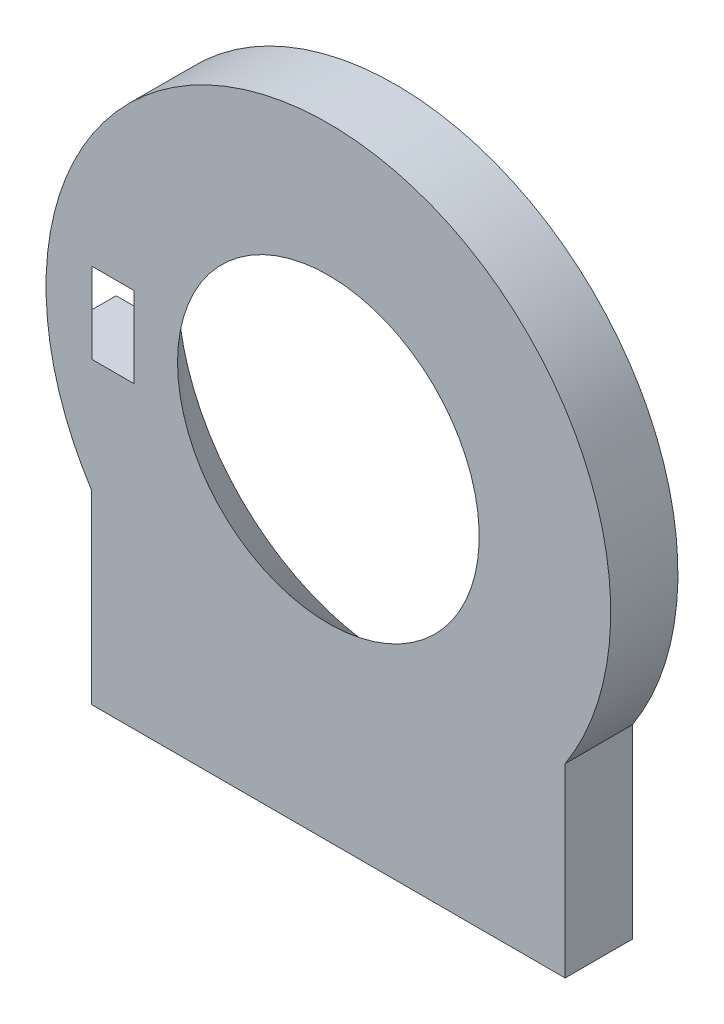
ISO-10303-21;
HEADER;
FILE_DESCRIPTION(('STEP AP214'),'2;1');
FILE_NAME('part.step','',(''),(''),'','','');
FILE_SCHEMA(('AUTOMOTIVE_DESIGN { 1 0 10303 214 1 1 1 1 }'));
ENDSEC;
DATA;
#1=APPLICATION_CONTEXT('core data for automotive mechanical design processes');
#2=APPLICATION_PROTOCOL_DEFINITION('international standard','automotive_design',2000,#1);
#3=PRODUCT_CONTEXT('',#1,'mechanical');
#4=PRODUCT('Part','Part','',(#3));
#5=PRODUCT_RELATED_PRODUCT_CATEGORY('part','',(#4));
#6=PRODUCT_DEFINITION_FORMATION('','',#4);
#7=PRODUCT_DEFINITION_CONTEXT('part definition',#1,'design');
#8=PRODUCT_DEFINITION('design','',#6,#7);
#9=PRODUCT_DEFINITION_SHAPE('','',#8);
#10=(LENGTH_UNIT() NAMED_UNIT(*) SI_UNIT(.MILLI.,.METRE.));
#11=(NAMED_UNIT(*) PLANE_ANGLE_UNIT() SI_UNIT($,.RADIAN.));
#12=(NAMED_UNIT(*) SI_UNIT($,.STERADIAN.) SOLID_ANGLE_UNIT());
#13=UNCERTAINTY_MEASURE_WITH_UNIT(LENGTH_MEASURE(1.E-05),#10,'distance_accuracy_value','');
#14=(GEOMETRIC_REPRESENTATION_CONTEXT(3) GLOBAL_UNCERTAINTY_ASSIGNED_CONTEXT((#13)) GLOBAL_UNIT_ASSIGNED_CONTEXT((#10,
#11,#12)) REPRESENTATION_CONTEXT('',''));
#15=CARTESIAN_POINT('',(0.,0.,0.));
#16=DIRECTION('',(0.,0.,1.));
#17=DIRECTION('',(1.,0.,0.));
#18=AXIS2_PLACEMENT_3D('',#15,#16,#17);
#19=CARTESIAN_POINT('',(0.,0.,10.));
#20=DIRECTION('',(0.,0.,-1.));
#21=DIRECTION('',(-1.,0.,0.));
#22=AXIS2_PLACEMENT_3D('',#19,#20,#21);
#23=CYLINDRICAL_SURFACE('',#22,42.);
#24=CARTESIAN_POINT('',(0.,0.,0.));
#25=DIRECTION('',(0.,0.,-1.));
#26=DIRECTION('',(-1.,0.,0.));
#27=AXIS2_PLACEMENT_3D('',#24,#25,#26);
#28=CIRCLE('',#27,42.);
#29=CARTESIAN_POINT('',(-41.5692193816531,6.,0.));
#30=VERTEX_POINT('',#29);
#31=CARTESIAN_POINT('',(35.2209667319211,-22.8797618534133,0.));
#32=VERTEX_POINT('',#31);
#33=EDGE_CURVE('E180',#30,#32,#28,.T.);
#34=ORIENTED_EDGE('',*,*,#33,.F.);
#35=DIRECTION('',(0.,0.,-1.));
#36=VECTOR('',#35,1.);
#37=CARTESIAN_POINT('',(-41.5692193816531,6.,10.));
#38=LINE('',#37,#36);
#39=CARTESIAN_POINT('',(-41.5692193816531,6.,5.62131024748512));
#40=VERTEX_POINT('',#39);
#41=EDGE_CURVE('E151',#30,#40,#38,.F.);
#42=ORIENTED_EDGE('',*,*,#41,.T.);
#43=CARTESIAN_POINT('',(0.,0.,34.0397707653471));
#44=DIRECTION('',(0.564364144456013,0.,-0.825525961101426));
#45=DIRECTION('',(-0.825525961101426,0.,-0.564364144456013));
#46=AXIS2_PLACEMENT_3D('',#43,#44,#45);
#47=ELLIPSE('',#46,50.8766555856864,42.);
#48=CARTESIAN_POINT('',(-41.5692193816531,-6.,5.62131024748512));
#49=VERTEX_POINT('',#48);
#50=EDGE_CURVE('E157',#40,#49,#47,.F.);
#51=ORIENTED_EDGE('',*,*,#50,.T.);
#52=DIRECTION('',(0.,0.,-1.));
#53=VECTOR('',#52,1.);
#54=CARTESIAN_POINT('',(-41.5692193816531,-6.,10.));
#55=LINE('',#54,#53);
#56=CARTESIAN_POINT('',(-41.5692193816531,-6.,0.));
#57=VERTEX_POINT('',#56);
#58=EDGE_CURVE('E149',#57,#49,#55,.F.);
#59=ORIENTED_EDGE('',*,*,#58,.F.);
#60=CARTESIAN_POINT('',(-35.2209667319211,-22.8797618534133,0.));
#61=VERTEX_POINT('',#60);
#62=EDGE_CURVE('E165',#61,#57,#28,.T.);
#63=ORIENTED_EDGE('',*,*,#62,.F.);
#64=DIRECTION('',(0.,0.,-1.));
#65=VECTOR('',#64,1.);
#66=CARTESIAN_POINT('',(-35.2209667319211,-22.8797618534133,10.));
#67=LINE('',#66,#65);
#68=CARTESIAN_POINT('',(-35.2209667319211,-22.8797618534133,10.));
#69=VERTEX_POINT('',#68);
#70=EDGE_CURVE('E172',#69,#61,#67,.T.);
#71=ORIENTED_EDGE('',*,*,#70,.F.);
#72=CARTESIAN_POINT('',(0.,0.,10.));
#73=DIRECTION('',(0.,0.,-1.));
#74=DIRECTION('',(-1.,0.,0.));
#75=AXIS2_PLACEMENT_3D('',#72,#73,#74);
#76=CIRCLE('',#75,42.);
#77=CARTESIAN_POINT('',(35.2209667319211,-22.8797618534133,10.));
#78=VERTEX_POINT('',#77);
#79=EDGE_CURVE('E169',#69,#78,#76,.T.);
#80=ORIENTED_EDGE('',*,*,#79,.T.);
#81=DIRECTION('',(0.,0.,-1.));
#82=VECTOR('',#81,1.);
#83=CARTESIAN_POINT('',(35.2209667319211,-22.8797618534133,10.));
#84=LINE('',#83,#82);
#85=EDGE_CURVE('E333',#78,#32,#84,.T.);
#86=ORIENTED_EDGE('',*,*,#85,.T.);
#87=EDGE_LOOP('',(#34,#42,#51,#59,#63,#71,#80,#86));
#88=FACE_BOUND('',#87,.T.);
#89=ADVANCED_FACE('F41',(#88),#23,.T.);
#90=CARTESIAN_POINT('',(0.,0.,10.));
#91=DIRECTION('',(0.,0.,-1.));
#92=DIRECTION('',(-1.,0.,0.));
#93=AXIS2_PLACEMENT_3D('',#90,#91,#92);
#94=PLANE('',#93);
#95=CARTESIAN_POINT('',(0.,0.,10.));
#96=DIRECTION('',(0.,0.,-1.));
#97=DIRECTION('',(-1.,0.,0.));
#98=AXIS2_PLACEMENT_3D('',#95,#96,#97);
#99=CIRCLE('',#98,22.4376085930251);
#100=CARTESIAN_POINT('',(-22.4376085930251,0.,10.));
#101=VERTEX_POINT('',#100);
#102=EDGE_CURVE('E141',#101,#101,#99,.T.);
#103=ORIENTED_EDGE('',*,*,#102,.T.);
#104=EDGE_LOOP('',(#103));
#105=FACE_BOUND('',#104,.T.);
#106=DIRECTION('',(0.,-1.,0.));
#107=VECTOR('',#106,1.);
#108=CARTESIAN_POINT('',(-35.2209667319211,-22.8797618534133,10.));
#109=LINE('',#108,#107);
#110=CARTESIAN_POINT('',(-35.2209667319211,-50.5,10.));
#111=VERTEX_POINT('',#110);
#112=EDGE_CURVE('E161',#69,#111,#109,.T.);
#113=ORIENTED_EDGE('',*,*,#112,.T.);
#114=DIRECTION('',(1.,0.,0.));
#115=VECTOR('',#114,1.);
#116=CARTESIAN_POINT('',(-35.2209667319211,-50.5,10.));
#117=LINE('',#116,#115);
#118=CARTESIAN_POINT('',(35.2209667319211,-50.5,10.));
#119=VERTEX_POINT('',#118);
#120=EDGE_CURVE('E164',#111,#119,#117,.T.);
#121=ORIENTED_EDGE('',*,*,#120,.T.);
#122=DIRECTION('',(0.,1.,0.));
#123=VECTOR('',#122,1.);
#124=CARTESIAN_POINT('',(35.2209667319211,-50.5,10.));
#125=LINE('',#124,#123);
#126=EDGE_CURVE('E167',#119,#78,#125,.T.);
#127=ORIENTED_EDGE('',*,*,#126,.T.);
#128=ORIENTED_EDGE('',*,*,#79,.F.);
#129=EDGE_LOOP('',(#113,#121,#127,#128));
#130=FACE_BOUND('',#129,.T.);
#131=DIRECTION('',(0.,1.,0.));
#132=VECTOR('',#131,1.);
#133=CARTESIAN_POINT('',(-28.9052919802373,6.,10.));
#134=LINE('',#133,#132);
#135=CARTESIAN_POINT('',(-28.9052919802373,-6.,10.));
#136=VERTEX_POINT('',#135);
#137=CARTESIAN_POINT('',(-28.9052919802373,6.,10.));
#138=VERTEX_POINT('',#137);
#139=EDGE_CURVE('E121',#136,#138,#134,.T.);
#140=ORIENTED_EDGE('',*,*,#139,.F.);
#141=DIRECTION('',(1.,0.,0.));
#142=VECTOR('',#141,1.);
#143=CARTESIAN_POINT('',(-35.164273033061,-6.,10.));
#144=LINE('',#143,#142);
#145=CARTESIAN_POINT('',(-35.164273033061,-6.,10.));
#146=VERTEX_POINT('',#145);
#147=EDGE_CURVE('E127',#146,#136,#144,.T.);
#148=ORIENTED_EDGE('',*,*,#147,.F.);
#149=DIRECTION('',(0.,-1.,0.));
#150=VECTOR('',#149,1.);
#151=CARTESIAN_POINT('',(-35.164273033061,6.,10.));
#152=LINE('',#151,#150);
#153=CARTESIAN_POINT('',(-35.164273033061,6.,10.));
#154=VERTEX_POINT('',#153);
#155=EDGE_CURVE('E130',#154,#146,#152,.T.);
#156=ORIENTED_EDGE('',*,*,#155,.F.);
#157=DIRECTION('',(-1.,0.,0.));
#158=VECTOR('',#157,1.);
#159=CARTESIAN_POINT('',(-35.164273033061,6.,10.));
#160=LINE('',#159,#158);
#161=EDGE_CURVE('E111',#138,#154,#160,.T.);
#162=ORIENTED_EDGE('',*,*,#161,.F.);
#163=EDGE_LOOP('',(#140,#148,#156,#162));
#164=FACE_BOUND('',#163,.T.);
#165=ADVANCED_FACE('F129',(#105,#130,#164),#94,.F.);
#166=CARTESIAN_POINT('',(0.,0.,0.));
#167=DIRECTION('',(0.,0.,-1.));
#168=DIRECTION('',(-1.,0.,0.));
#169=AXIS2_PLACEMENT_3D('',#166,#167,#168);
#170=PLANE('',#169);
#171=CARTESIAN_POINT('',(0.,0.,0.));
#172=DIRECTION('',(0.,0.,-1.));
#173=DIRECTION('',(-1.,0.,0.));
#174=AXIS2_PLACEMENT_3D('',#171,#172,#173);
#175=CIRCLE('',#174,32.4376085930251);
#176=CARTESIAN_POINT('',(-32.4376085930251,0.,0.));
#177=VERTEX_POINT('',#176);
#178=EDGE_CURVE('E12',#177,#177,#175,.F.);
#179=ORIENTED_EDGE('',*,*,#178,.T.);
#180=EDGE_LOOP('',(#179));
#181=FACE_BOUND('',#180,.T.);
#182=DIRECTION('',(0.,-1.,0.));
#183=VECTOR('',#182,1.);
#184=CARTESIAN_POINT('',(-32.6389103434082,6.,0.));
#185=LINE('',#184,#183);
#186=CARTESIAN_POINT('',(-32.6389103434082,6.,0.));
#187=VERTEX_POINT('',#186);
#188=CARTESIAN_POINT('',(-32.6389103434082,-6.,0.));
#189=VERTEX_POINT('',#188);
#190=EDGE_CURVE('E240',#187,#189,#185,.T.);
#191=ORIENTED_EDGE('',*,*,#190,.F.);
#192=DIRECTION('',(-1.,0.,0.));
#193=VECTOR('',#192,1.);
#194=CARTESIAN_POINT('',(0.,6.,0.));
#195=LINE('',#194,#193);
#196=EDGE_CURVE('E50',#187,#30,#195,.T.);
#197=ORIENTED_EDGE('',*,*,#196,.T.);
#198=ORIENTED_EDGE('',*,*,#33,.T.);
#199=DIRECTION('',(0.,1.,0.));
#200=VECTOR('',#199,1.);
#201=CARTESIAN_POINT('',(35.2209667319211,-50.5,0.));
#202=LINE('',#201,#200);
#203=CARTESIAN_POINT('',(35.2209667319211,-50.5,0.));
#204=VERTEX_POINT('',#203);
#205=EDGE_CURVE('E177',#204,#32,#202,.T.);
#206=ORIENTED_EDGE('',*,*,#205,.F.);
#207=DIRECTION('',(1.,0.,0.));
#208=VECTOR('',#207,1.);
#209=CARTESIAN_POINT('',(-35.2209667319211,-50.5,0.));
#210=LINE('',#209,#208);
#211=CARTESIAN_POINT('',(-35.2209667319211,-50.5,0.));
#212=VERTEX_POINT('',#211);
#213=EDGE_CURVE('E175',#212,#204,#210,.T.);
#214=ORIENTED_EDGE('',*,*,#213,.F.);
#215=DIRECTION('',(0.,-1.,0.));
#216=VECTOR('',#215,1.);
#217=CARTESIAN_POINT('',(-35.2209667319211,-22.8797618534133,0.));
#218=LINE('',#217,#216);
#219=EDGE_CURVE('E160',#61,#212,#218,.T.);
#220=ORIENTED_EDGE('',*,*,#219,.F.);
#221=ORIENTED_EDGE('',*,*,#62,.T.);
#222=DIRECTION('',(-1.,0.,0.));
#223=VECTOR('',#222,1.);
#224=CARTESIAN_POINT('',(-32.6389103434082,-6.,0.));
#225=LINE('',#224,#223);
#226=EDGE_CURVE('E152',#189,#57,#225,.T.);
#227=ORIENTED_EDGE('',*,*,#226,.F.);
#228=EDGE_LOOP('',(#191,#197,#198,#206,#214,#220,#221,#227));
#229=FACE_BOUND('',#228,.T.);
#230=ADVANCED_FACE('F203',(#181,#229),#170,.T.);
#231=CARTESIAN_POINT('',(-35.2209667319211,-22.8797618534133,10.));
#232=DIRECTION('',(1.,0.,0.));
#233=DIRECTION('',(0.,1.,0.));
#234=AXIS2_PLACEMENT_3D('',#231,#232,#233);
#235=PLANE('',#234);
#236=ORIENTED_EDGE('',*,*,#219,.T.);
#237=DIRECTION('',(0.,0.,-1.));
#238=VECTOR('',#237,1.);
#239=CARTESIAN_POINT('',(-35.2209667319211,-50.5,10.));
#240=LINE('',#239,#238);
#241=EDGE_CURVE('E187',#111,#212,#240,.T.);
#242=ORIENTED_EDGE('',*,*,#241,.F.);
#243=ORIENTED_EDGE('',*,*,#112,.F.);
#244=ORIENTED_EDGE('',*,*,#70,.T.);
#245=EDGE_LOOP('',(#236,#242,#243,#244));
#246=FACE_BOUND('',#245,.T.);
#247=ADVANCED_FACE('F210',(#246),#235,.F.);
#248=CARTESIAN_POINT('',(-35.2209667319211,-50.5,10.));
#249=DIRECTION('',(0.,1.,0.));
#250=DIRECTION('',(0.,0.,1.));
#251=AXIS2_PLACEMENT_3D('',#248,#249,#250);
#252=PLANE('',#251);
#253=ORIENTED_EDGE('',*,*,#213,.T.);
#254=DIRECTION('',(0.,0.,-1.));
#255=VECTOR('',#254,1.);
#256=CARTESIAN_POINT('',(35.2209667319211,-50.5,10.));
#257=LINE('',#256,#255);
#258=EDGE_CURVE('E334',#119,#204,#257,.T.);
#259=ORIENTED_EDGE('',*,*,#258,.F.);
#260=ORIENTED_EDGE('',*,*,#120,.F.);
#261=ORIENTED_EDGE('',*,*,#241,.T.);
#262=EDGE_LOOP('',(#253,#259,#260,#261));
#263=FACE_BOUND('',#262,.T.);
#264=ADVANCED_FACE('F218',(#263),#252,.F.);
#265=CARTESIAN_POINT('',(35.2209667319211,-50.5,10.));
#266=DIRECTION('',(-1.,0.,0.));
#267=DIRECTION('',(0.,-1.,0.));
#268=AXIS2_PLACEMENT_3D('',#265,#266,#267);
#269=PLANE('',#268);
#270=ORIENTED_EDGE('',*,*,#205,.T.);
#271=ORIENTED_EDGE('',*,*,#85,.F.);
#272=ORIENTED_EDGE('',*,*,#126,.F.);
#273=ORIENTED_EDGE('',*,*,#258,.T.);
#274=EDGE_LOOP('',(#270,#271,#272,#273));
#275=FACE_BOUND('',#274,.T.);
#276=ADVANCED_FACE('F215',(#275),#269,.F.);
#277=CARTESIAN_POINT('',(-28.645723404383,0.,10.6952198928918));
#278=DIRECTION('',(-0.936832764970797,0.,0.349777601451511));
#279=DIRECTION('',(0.349777601451511,0.,0.936832764970797));
#280=AXIS2_PLACEMENT_3D('',#277,#278,#279);
#281=PLANE('',#280);
#282=DIRECTION('',(-0.349777601451511,0.,-0.936832764970797));
#283=VECTOR('',#282,1.);
#284=CARTESIAN_POINT('',(-28.9052919802373,-6.,10.));
#285=LINE('',#284,#283);
#286=EDGE_CURVE('E118',#136,#189,#285,.T.);
#287=ORIENTED_EDGE('',*,*,#286,.F.);
#288=ORIENTED_EDGE('',*,*,#139,.T.);
#289=DIRECTION('',(-0.349777601451511,0.,-0.936832764970797));
#290=VECTOR('',#289,1.);
#291=CARTESIAN_POINT('',(-28.9052919802373,6.,10.));
#292=LINE('',#291,#290);
#293=EDGE_CURVE('E107',#138,#187,#292,.T.);
#294=ORIENTED_EDGE('',*,*,#293,.T.);
#295=ORIENTED_EDGE('',*,*,#190,.T.);
#296=EDGE_LOOP('',(#287,#288,#294,#295));
#297=FACE_BOUND('',#296,.T.);
#298=ADVANCED_FACE('F122',(#297),#281,.T.);
#299=CARTESIAN_POINT('',(0.,6.,0.));
#300=DIRECTION('',(0.,-1.,0.));
#301=DIRECTION('',(0.,0.,-1.));
#302=AXIS2_PLACEMENT_3D('',#299,#300,#301);
#303=PLANE('',#302);
#304=ORIENTED_EDGE('',*,*,#196,.F.);
#305=ORIENTED_EDGE('',*,*,#293,.F.);
#306=ORIENTED_EDGE('',*,*,#161,.T.);
#307=DIRECTION('',(-0.825525961101426,0.,-0.564364144456013));
#308=VECTOR('',#307,1.);
#309=CARTESIAN_POINT('',(-35.164273033061,6.,10.));
#310=LINE('',#309,#308);
#311=EDGE_CURVE('E57',#154,#40,#310,.T.);
#312=ORIENTED_EDGE('',*,*,#311,.T.);
#313=ORIENTED_EDGE('',*,*,#41,.F.);
#314=EDGE_LOOP('',(#304,#305,#306,#312,#313));
#315=FACE_BOUND('',#314,.T.);
#316=ADVANCED_FACE('F109',(#315),#303,.T.);
#317=CARTESIAN_POINT('',(0.,-6.,0.));
#318=DIRECTION('',(0.,-1.,0.));
#319=DIRECTION('',(0.,0.,-1.));
#320=AXIS2_PLACEMENT_3D('',#317,#318,#319);
#321=PLANE('',#320);
#322=ORIENTED_EDGE('',*,*,#58,.T.);
#323=DIRECTION('',(-0.825525961101426,0.,-0.564364144456013));
#324=VECTOR('',#323,1.);
#325=CARTESIAN_POINT('',(-35.164273033061,-6.,10.));
#326=LINE('',#325,#324);
#327=EDGE_CURVE('E117',#146,#49,#326,.T.);
#328=ORIENTED_EDGE('',*,*,#327,.F.);
#329=ORIENTED_EDGE('',*,*,#147,.T.);
#330=ORIENTED_EDGE('',*,*,#286,.T.);
#331=ORIENTED_EDGE('',*,*,#226,.T.);
#332=EDGE_LOOP('',(#322,#328,#329,#330,#331));
#333=FACE_BOUND('',#332,.T.);
#334=ADVANCED_FACE('F238',(#333),#321,.F.);
#335=CARTESIAN_POINT('',(-15.8590356842655,0.,23.1978693260437));
#336=DIRECTION('',(0.564364144456013,0.,-0.825525961101426));
#337=DIRECTION('',(-0.825525961101426,0.,-0.564364144456013));
#338=AXIS2_PLACEMENT_3D('',#335,#336,#337);
#339=PLANE('',#338);
#340=ORIENTED_EDGE('',*,*,#311,.F.);
#341=ORIENTED_EDGE('',*,*,#155,.T.);
#342=ORIENTED_EDGE('',*,*,#327,.T.);
#343=ORIENTED_EDGE('',*,*,#50,.F.);
#344=EDGE_LOOP('',(#340,#341,#342,#343));
#345=FACE_BOUND('',#344,.T.);
#346=ADVANCED_FACE('F205',(#345),#339,.T.);
#347=CARTESIAN_POINT('',(0.,0.,10.));
#348=DIRECTION('',(0.,0.,-1.));
#349=DIRECTION('',(-1.,0.,0.));
#350=AXIS2_PLACEMENT_3D('',#347,#348,#349);
#351=CONICAL_SURFACE('',#350,22.4376085930251,0.78539816339745);
#352=ORIENTED_EDGE('',*,*,#178,.F.);
#353=EDGE_LOOP('',(#352));
#354=FACE_BOUND('',#353,.T.);
#355=ORIENTED_EDGE('',*,*,#102,.F.);
#356=EDGE_LOOP('',(#355));
#357=FACE_BOUND('',#356,.T.);
#358=ADVANCED_FACE('F43',(#354,#357),#351,.F.);
#359=CLOSED_SHELL('',(#89,#165,#230,#247,#264,#276,#298,#316,#334,#346,#358));
#360=MANIFOLD_SOLID_BREP('B2',#359);
#361=ADVANCED_BREP_SHAPE_REPRESENTATION('',(#18,#360),#14);
#362=SHAPE_DEFINITION_REPRESENTATION(#9,#361);
ENDSEC;
END-ISO-10303-21;
